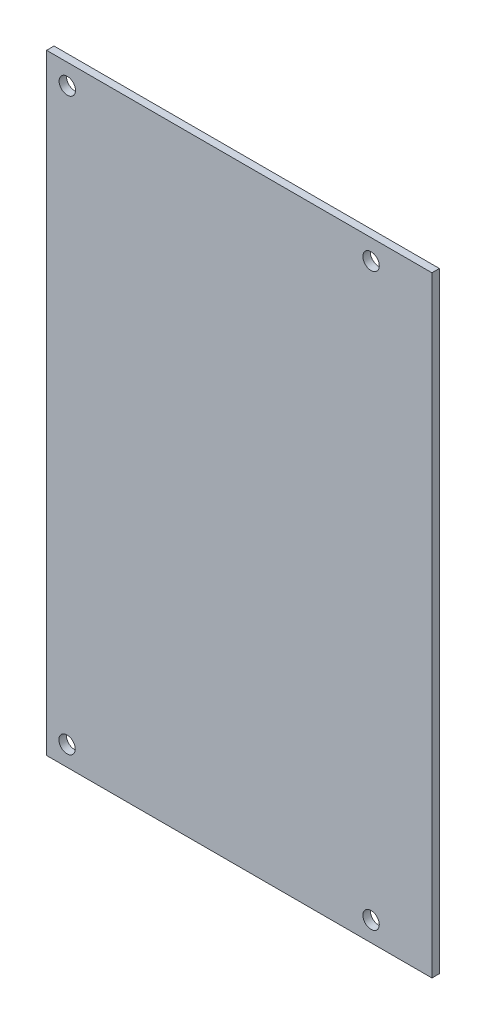
ISO-10303-21;
HEADER;
FILE_DESCRIPTION(('STEP AP214'),'2;1');
FILE_NAME('part.step','',(''),(''),'','','');
FILE_SCHEMA(('AUTOMOTIVE_DESIGN { 1 0 10303 214 1 1 1 1 }'));
ENDSEC;
DATA;
#1=APPLICATION_CONTEXT('core data for automotive mechanical design processes');
#2=APPLICATION_PROTOCOL_DEFINITION('international standard','automotive_design',2000,#1);
#3=PRODUCT_CONTEXT('',#1,'mechanical');
#4=PRODUCT('Part','Part','',(#3));
#5=PRODUCT_RELATED_PRODUCT_CATEGORY('part','',(#4));
#6=PRODUCT_DEFINITION_FORMATION('','',#4);
#7=PRODUCT_DEFINITION_CONTEXT('part definition',#1,'design');
#8=PRODUCT_DEFINITION('design','',#6,#7);
#9=PRODUCT_DEFINITION_SHAPE('','',#8);
#10=(LENGTH_UNIT() NAMED_UNIT(*) SI_UNIT(.MILLI.,.METRE.));
#11=(NAMED_UNIT(*) PLANE_ANGLE_UNIT() SI_UNIT($,.RADIAN.));
#12=(NAMED_UNIT(*) SI_UNIT($,.STERADIAN.) SOLID_ANGLE_UNIT());
#13=UNCERTAINTY_MEASURE_WITH_UNIT(LENGTH_MEASURE(1.E-05),#10,'distance_accuracy_value','');
#14=(GEOMETRIC_REPRESENTATION_CONTEXT(3) GLOBAL_UNCERTAINTY_ASSIGNED_CONTEXT((#13)) GLOBAL_UNIT_ASSIGNED_CONTEXT((#10,
#11,#12)) REPRESENTATION_CONTEXT('',''));
#15=CARTESIAN_POINT('',(0.,0.,0.));
#16=DIRECTION('',(0.,0.,1.));
#17=DIRECTION('',(1.,0.,0.));
#18=AXIS2_PLACEMENT_3D('',#15,#16,#17);
#19=CARTESIAN_POINT('',(0.,0.,1.5));
#20=DIRECTION('',(0.,0.,1.));
#21=DIRECTION('',(1.,0.,0.));
#22=AXIS2_PLACEMENT_3D('',#19,#20,#21);
#23=PLANE('',#22);
#24=CARTESIAN_POINT('',(78.232,3.99899999999999,1.5));
#25=DIRECTION('',(0.,0.,1.));
#26=DIRECTION('',(1.,0.,0.));
#27=AXIS2_PLACEMENT_3D('',#24,#25,#26);
#28=CIRCLE('',#27,1.65);
#29=CARTESIAN_POINT('',(79.882,3.99899999999999,1.5));
#30=VERTEX_POINT('',#29);
#31=EDGE_CURVE('E122',#30,#30,#28,.T.);
#32=ORIENTED_EDGE('',*,*,#31,.F.);
#33=EDGE_LOOP('',(#32));
#34=FACE_BOUND('',#33,.T.);
#35=CARTESIAN_POINT('',(17.0002,118.999,1.5));
#36=DIRECTION('',(0.,0.,1.));
#37=DIRECTION('',(1.,0.,0.));
#38=AXIS2_PLACEMENT_3D('',#35,#36,#37);
#39=CIRCLE('',#38,1.65);
#40=CARTESIAN_POINT('',(18.6502,118.999,1.5));
#41=VERTEX_POINT('',#40);
#42=EDGE_CURVE('E101',#41,#41,#39,.T.);
#43=ORIENTED_EDGE('',*,*,#42,.F.);
#44=EDGE_LOOP('',(#43));
#45=FACE_BOUND('',#44,.T.);
#46=DIRECTION('',(0.,-1.,0.));
#47=VECTOR('',#46,1.);
#48=CARTESIAN_POINT('',(12.827,0.,1.5));
#49=LINE('',#48,#47);
#50=CARTESIAN_POINT('',(12.827,123.101,1.5));
#51=VERTEX_POINT('',#50);
#52=CARTESIAN_POINT('',(12.827,0.,1.5));
#53=VERTEX_POINT('',#52);
#54=EDGE_CURVE('E85',#51,#53,#49,.T.);
#55=ORIENTED_EDGE('',*,*,#54,.T.);
#56=DIRECTION('',(1.,0.,0.));
#57=VECTOR('',#56,1.);
#58=CARTESIAN_POINT('',(12.827,0.,1.5));
#59=LINE('',#58,#57);
#60=CARTESIAN_POINT('',(90.5002,0.,1.5));
#61=VERTEX_POINT('',#60);
#62=EDGE_CURVE('E80',#53,#61,#59,.T.);
#63=ORIENTED_EDGE('',*,*,#62,.T.);
#64=DIRECTION('',(0.,1.,0.));
#65=VECTOR('',#64,1.);
#66=CARTESIAN_POINT('',(90.5002,0.,1.5));
#67=LINE('',#66,#65);
#68=CARTESIAN_POINT('',(90.5002,123.101,1.5));
#69=VERTEX_POINT('',#68);
#70=EDGE_CURVE('E83',#61,#69,#67,.T.);
#71=ORIENTED_EDGE('',*,*,#70,.T.);
#72=DIRECTION('',(-1.,0.,0.));
#73=VECTOR('',#72,1.);
#74=CARTESIAN_POINT('',(90.5002,123.101,1.5));
#75=LINE('',#74,#73);
#76=EDGE_CURVE('E51',#69,#51,#75,.T.);
#77=ORIENTED_EDGE('',*,*,#76,.T.);
#78=EDGE_LOOP('',(#55,#63,#71,#77));
#79=FACE_BOUND('',#78,.T.);
#80=CARTESIAN_POINT('',(16.9545,4.0005,1.5));
#81=DIRECTION('',(0.,0.,1.));
#82=DIRECTION('',(1.,0.,0.));
#83=AXIS2_PLACEMENT_3D('',#80,#81,#82);
#84=CIRCLE('',#83,1.65);
#85=CARTESIAN_POINT('',(18.6045,4.0005,1.5));
#86=VERTEX_POINT('',#85);
#87=EDGE_CURVE('E116',#86,#86,#84,.T.);
#88=ORIENTED_EDGE('',*,*,#87,.F.);
#89=EDGE_LOOP('',(#88));
#90=FACE_BOUND('',#89,.T.);
#91=CARTESIAN_POINT('',(78.232,118.999,1.5));
#92=DIRECTION('',(0.,0.,1.));
#93=DIRECTION('',(1.,0.,0.));
#94=AXIS2_PLACEMENT_3D('',#91,#92,#93);
#95=CIRCLE('',#94,1.65);
#96=CARTESIAN_POINT('',(79.882,118.999,1.5));
#97=VERTEX_POINT('',#96);
#98=EDGE_CURVE('E128',#97,#97,#95,.T.);
#99=ORIENTED_EDGE('',*,*,#98,.F.);
#100=EDGE_LOOP('',(#99));
#101=FACE_BOUND('',#100,.T.);
#102=ADVANCED_FACE('F34',(#34,#45,#79,#90,#101),#23,.T.);
#103=CARTESIAN_POINT('',(0.,0.,0.));
#104=DIRECTION('',(0.,0.,1.));
#105=DIRECTION('',(1.,0.,0.));
#106=AXIS2_PLACEMENT_3D('',#103,#104,#105);
#107=PLANE('',#106);
#108=CARTESIAN_POINT('',(78.232,3.99899999999999,0.));
#109=DIRECTION('',(0.,0.,1.));
#110=DIRECTION('',(1.,0.,0.));
#111=AXIS2_PLACEMENT_3D('',#108,#109,#110);
#112=CIRCLE('',#111,1.65);
#113=CARTESIAN_POINT('',(79.882,3.99899999999999,0.));
#114=VERTEX_POINT('',#113);
#115=EDGE_CURVE('E125',#114,#114,#112,.T.);
#116=ORIENTED_EDGE('',*,*,#115,.T.);
#117=EDGE_LOOP('',(#116));
#118=FACE_BOUND('',#117,.T.);
#119=CARTESIAN_POINT('',(17.0002,118.999,0.));
#120=DIRECTION('',(0.,0.,1.));
#121=DIRECTION('',(1.,0.,0.));
#122=AXIS2_PLACEMENT_3D('',#119,#120,#121);
#123=CIRCLE('',#122,1.65);
#124=CARTESIAN_POINT('',(18.6502,118.999,0.));
#125=VERTEX_POINT('',#124);
#126=EDGE_CURVE('E113',#125,#125,#123,.T.);
#127=ORIENTED_EDGE('',*,*,#126,.T.);
#128=EDGE_LOOP('',(#127));
#129=FACE_BOUND('',#128,.T.);
#130=DIRECTION('',(0.,-1.,0.));
#131=VECTOR('',#130,1.);
#132=CARTESIAN_POINT('',(12.827,0.,0.));
#133=LINE('',#132,#131);
#134=CARTESIAN_POINT('',(12.827,123.101,0.));
#135=VERTEX_POINT('',#134);
#136=CARTESIAN_POINT('',(12.827,0.,0.));
#137=VERTEX_POINT('',#136);
#138=EDGE_CURVE('E98',#135,#137,#133,.T.);
#139=ORIENTED_EDGE('',*,*,#138,.F.);
#140=DIRECTION('',(-1.,0.,0.));
#141=VECTOR('',#140,1.);
#142=CARTESIAN_POINT('',(90.5002,123.101,0.));
#143=LINE('',#142,#141);
#144=CARTESIAN_POINT('',(90.5002,123.101,0.));
#145=VERTEX_POINT('',#144);
#146=EDGE_CURVE('E73',#145,#135,#143,.T.);
#147=ORIENTED_EDGE('',*,*,#146,.F.);
#148=DIRECTION('',(0.,1.,0.));
#149=VECTOR('',#148,1.);
#150=CARTESIAN_POINT('',(90.5002,123.101,0.));
#151=LINE('',#150,#149);
#152=CARTESIAN_POINT('',(90.5002,0.,0.));
#153=VERTEX_POINT('',#152);
#154=EDGE_CURVE('E67',#153,#145,#151,.T.);
#155=ORIENTED_EDGE('',*,*,#154,.F.);
#156=DIRECTION('',(1.,0.,0.));
#157=VECTOR('',#156,1.);
#158=CARTESIAN_POINT('',(12.827,0.,0.));
#159=LINE('',#158,#157);
#160=EDGE_CURVE('E90',#137,#153,#159,.T.);
#161=ORIENTED_EDGE('',*,*,#160,.F.);
#162=EDGE_LOOP('',(#139,#147,#155,#161));
#163=FACE_BOUND('',#162,.T.);
#164=CARTESIAN_POINT('',(16.9545,4.0005,0.));
#165=DIRECTION('',(0.,0.,1.));
#166=DIRECTION('',(1.,0.,0.));
#167=AXIS2_PLACEMENT_3D('',#164,#165,#166);
#168=CIRCLE('',#167,1.65);
#169=CARTESIAN_POINT('',(18.6045,4.0005,0.));
#170=VERTEX_POINT('',#169);
#171=EDGE_CURVE('E119',#170,#170,#168,.T.);
#172=ORIENTED_EDGE('',*,*,#171,.T.);
#173=EDGE_LOOP('',(#172));
#174=FACE_BOUND('',#173,.T.);
#175=CARTESIAN_POINT('',(78.232,118.999,0.));
#176=DIRECTION('',(0.,0.,1.));
#177=DIRECTION('',(1.,0.,0.));
#178=AXIS2_PLACEMENT_3D('',#175,#176,#177);
#179=CIRCLE('',#178,1.65);
#180=CARTESIAN_POINT('',(79.882,118.999,0.));
#181=VERTEX_POINT('',#180);
#182=EDGE_CURVE('E131',#181,#181,#179,.T.);
#183=ORIENTED_EDGE('',*,*,#182,.T.);
#184=EDGE_LOOP('',(#183));
#185=FACE_BOUND('',#184,.T.);
#186=ADVANCED_FACE('F109',(#118,#129,#163,#174,#185),#107,.F.);
#187=CARTESIAN_POINT('',(12.827,0.,1.5));
#188=DIRECTION('',(1.,0.,0.));
#189=DIRECTION('',(0.,1.,0.));
#190=AXIS2_PLACEMENT_3D('',#187,#188,#189);
#191=PLANE('',#190);
#192=ORIENTED_EDGE('',*,*,#138,.T.);
#193=DIRECTION('',(0.,0.,-1.));
#194=VECTOR('',#193,1.);
#195=CARTESIAN_POINT('',(12.827,0.,1.5));
#196=LINE('',#195,#194);
#197=EDGE_CURVE('E11',#53,#137,#196,.T.);
#198=ORIENTED_EDGE('',*,*,#197,.F.);
#199=ORIENTED_EDGE('',*,*,#54,.F.);
#200=DIRECTION('',(0.,0.,-1.));
#201=VECTOR('',#200,1.);
#202=CARTESIAN_POINT('',(12.827,123.101,1.5));
#203=LINE('',#202,#201);
#204=EDGE_CURVE('E94',#51,#135,#203,.T.);
#205=ORIENTED_EDGE('',*,*,#204,.T.);
#206=EDGE_LOOP('',(#192,#198,#199,#205));
#207=FACE_BOUND('',#206,.T.);
#208=ADVANCED_FACE('F36',(#207),#191,.F.);
#209=CARTESIAN_POINT('',(12.827,0.,1.5));
#210=DIRECTION('',(0.,1.,0.));
#211=DIRECTION('',(0.,0.,1.));
#212=AXIS2_PLACEMENT_3D('',#209,#210,#211);
#213=PLANE('',#212);
#214=ORIENTED_EDGE('',*,*,#160,.T.);
#215=DIRECTION('',(0.,0.,-1.));
#216=VECTOR('',#215,1.);
#217=CARTESIAN_POINT('',(90.5002,0.,1.5));
#218=LINE('',#217,#216);
#219=EDGE_CURVE('E43',#61,#153,#218,.T.);
#220=ORIENTED_EDGE('',*,*,#219,.F.);
#221=ORIENTED_EDGE('',*,*,#62,.F.);
#222=ORIENTED_EDGE('',*,*,#197,.T.);
#223=EDGE_LOOP('',(#214,#220,#221,#222));
#224=FACE_BOUND('',#223,.T.);
#225=ADVANCED_FACE('F89',(#224),#213,.F.);
#226=CARTESIAN_POINT('',(90.5002,123.101,1.5));
#227=DIRECTION('',(-1.,0.,0.));
#228=DIRECTION('',(0.,0.,1.));
#229=AXIS2_PLACEMENT_3D('',#226,#227,#228);
#230=PLANE('',#229);
#231=ORIENTED_EDGE('',*,*,#154,.T.);
#232=DIRECTION('',(0.,0.,-1.));
#233=VECTOR('',#232,1.);
#234=CARTESIAN_POINT('',(90.5002,123.101,1.5));
#235=LINE('',#234,#233);
#236=EDGE_CURVE('E91',#69,#145,#235,.T.);
#237=ORIENTED_EDGE('',*,*,#236,.F.);
#238=ORIENTED_EDGE('',*,*,#70,.F.);
#239=ORIENTED_EDGE('',*,*,#219,.T.);
#240=EDGE_LOOP('',(#231,#237,#238,#239));
#241=FACE_BOUND('',#240,.T.);
#242=ADVANCED_FACE('F92',(#241),#230,.F.);
#243=CARTESIAN_POINT('',(90.5002,123.101,1.5));
#244=DIRECTION('',(0.,-1.,0.));
#245=DIRECTION('',(0.,0.,-1.));
#246=AXIS2_PLACEMENT_3D('',#243,#244,#245);
#247=PLANE('',#246);
#248=ORIENTED_EDGE('',*,*,#146,.T.);
#249=ORIENTED_EDGE('',*,*,#204,.F.);
#250=ORIENTED_EDGE('',*,*,#76,.F.);
#251=ORIENTED_EDGE('',*,*,#236,.T.);
#252=EDGE_LOOP('',(#248,#249,#250,#251));
#253=FACE_BOUND('',#252,.T.);
#254=ADVANCED_FACE('F106',(#253),#247,.F.);
#255=CARTESIAN_POINT('',(17.0002,118.999,1.5));
#256=DIRECTION('',(0.,0.,-1.));
#257=DIRECTION('',(-1.,0.,0.));
#258=AXIS2_PLACEMENT_3D('',#255,#256,#257);
#259=CYLINDRICAL_SURFACE('',#258,1.65);
#260=ORIENTED_EDGE('',*,*,#42,.T.);
#261=EDGE_LOOP('',(#260));
#262=FACE_BOUND('',#261,.T.);
#263=ORIENTED_EDGE('',*,*,#126,.F.);
#264=EDGE_LOOP('',(#263));
#265=FACE_BOUND('',#264,.T.);
#266=ADVANCED_FACE('F151',(#262,#265),#259,.F.);
#267=CARTESIAN_POINT('',(16.9545,4.0005,1.5));
#268=DIRECTION('',(0.,0.,-1.));
#269=DIRECTION('',(-1.,0.,0.));
#270=AXIS2_PLACEMENT_3D('',#267,#268,#269);
#271=CYLINDRICAL_SURFACE('',#270,1.65);
#272=ORIENTED_EDGE('',*,*,#87,.T.);
#273=EDGE_LOOP('',(#272));
#274=FACE_BOUND('',#273,.T.);
#275=ORIENTED_EDGE('',*,*,#171,.F.);
#276=EDGE_LOOP('',(#275));
#277=FACE_BOUND('',#276,.T.);
#278=ADVANCED_FACE('F203',(#274,#277),#271,.F.);
#279=CARTESIAN_POINT('',(78.232,3.99899999999999,1.5));
#280=DIRECTION('',(0.,0.,-1.));
#281=DIRECTION('',(-1.,0.,0.));
#282=AXIS2_PLACEMENT_3D('',#279,#280,#281);
#283=CYLINDRICAL_SURFACE('',#282,1.65);
#284=ORIENTED_EDGE('',*,*,#31,.T.);
#285=EDGE_LOOP('',(#284));
#286=FACE_BOUND('',#285,.T.);
#287=ORIENTED_EDGE('',*,*,#115,.F.);
#288=EDGE_LOOP('',(#287));
#289=FACE_BOUND('',#288,.T.);
#290=ADVANCED_FACE('F211',(#286,#289),#283,.F.);
#291=CARTESIAN_POINT('',(78.232,118.999,1.5));
#292=DIRECTION('',(0.,0.,-1.));
#293=DIRECTION('',(-1.,0.,0.));
#294=AXIS2_PLACEMENT_3D('',#291,#292,#293);
#295=CYLINDRICAL_SURFACE('',#294,1.65);
#296=ORIENTED_EDGE('',*,*,#98,.T.);
#297=EDGE_LOOP('',(#296));
#298=FACE_BOUND('',#297,.T.);
#299=ORIENTED_EDGE('',*,*,#182,.F.);
#300=EDGE_LOOP('',(#299));
#301=FACE_BOUND('',#300,.T.);
#302=ADVANCED_FACE('F137',(#298,#301),#295,.F.);
#303=CLOSED_SHELL('',(#102,#186,#208,#225,#242,#254,#266,#278,#290,#302));
#304=MANIFOLD_SOLID_BREP('B2',#303);
#305=ADVANCED_BREP_SHAPE_REPRESENTATION('',(#18,#304),#14);
#306=SHAPE_DEFINITION_REPRESENTATION(#9,#305);
ENDSEC;
END-ISO-10303-21;
